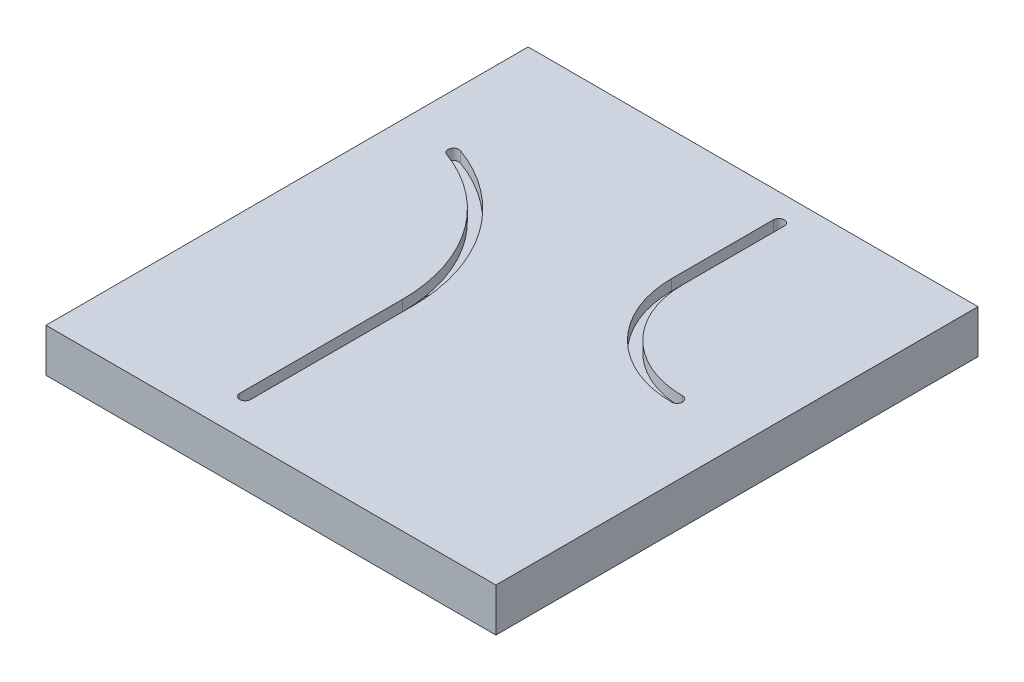
ISO-10303-21;
HEADER;
FILE_DESCRIPTION(('STEP AP214'),'2;1');
FILE_NAME('part.step','',(''),(''),'','','');
FILE_SCHEMA(('AUTOMOTIVE_DESIGN { 1 0 10303 214 1 1 1 1 }'));
ENDSEC;
DATA;
#1=APPLICATION_CONTEXT('core data for automotive mechanical design processes');
#2=APPLICATION_PROTOCOL_DEFINITION('international standard','automotive_design',2000,#1);
#3=PRODUCT_CONTEXT('',#1,'mechanical');
#4=PRODUCT('Part','Part','',(#3));
#5=PRODUCT_RELATED_PRODUCT_CATEGORY('part','',(#4));
#6=PRODUCT_DEFINITION_FORMATION('','',#4);
#7=PRODUCT_DEFINITION_CONTEXT('part definition',#1,'design');
#8=PRODUCT_DEFINITION('design','',#6,#7);
#9=PRODUCT_DEFINITION_SHAPE('','',#8);
#10=(LENGTH_UNIT() NAMED_UNIT(*) SI_UNIT(.MILLI.,.METRE.));
#11=(NAMED_UNIT(*) PLANE_ANGLE_UNIT() SI_UNIT($,.RADIAN.));
#12=(NAMED_UNIT(*) SI_UNIT($,.STERADIAN.) SOLID_ANGLE_UNIT());
#13=UNCERTAINTY_MEASURE_WITH_UNIT(LENGTH_MEASURE(1.E-05),#10,'distance_accuracy_value','');
#14=(GEOMETRIC_REPRESENTATION_CONTEXT(3) GLOBAL_UNCERTAINTY_ASSIGNED_CONTEXT((#13)) GLOBAL_UNIT_ASSIGNED_CONTEXT((#10,
#11,#12)) REPRESENTATION_CONTEXT('',''));
#15=CARTESIAN_POINT('',(0.,0.,0.));
#16=DIRECTION('',(0.,0.,1.));
#17=DIRECTION('',(1.,0.,0.));
#18=AXIS2_PLACEMENT_3D('',#15,#16,#17);
#19=CARTESIAN_POINT('',(0.,-8.,0.));
#20=DIRECTION('',(0.,-1.,0.));
#21=DIRECTION('',(0.,0.,-1.));
#22=AXIS2_PLACEMENT_3D('',#19,#20,#21);
#23=PLANE('',#22);
#24=DIRECTION('',(-0.214029557563818,0.,0.976827184556734));
#25=VECTOR('',#24,1.);
#26=CARTESIAN_POINT('',(-27.4536543691135,-8.,59.5719408848724));
#27=LINE('',#26,#25);
#28=CARTESIAN_POINT('',(-1.52559525398586,-8.,-58.7632707313958));
#29=VERTEX_POINT('',#28);
#30=CARTESIAN_POINT('',(-27.8817134842411,-8.,61.5255952539858));
#31=VERTEX_POINT('',#30);
#32=EDGE_CURVE('E346',#29,#31,#27,.T.);
#33=ORIENTED_EDGE('',*,*,#32,.F.);
#34=DIRECTION('',(-0.976827184556734,0.,-0.214029557563819));
#35=VECTOR('',#34,1.);
#36=CARTESIAN_POINT('',(-1.52559525398583,-8.,-58.7632707313957));
#37=LINE('',#36,#35);
#38=CARTESIAN_POINT('',(2.38171348424111,-8.,-57.9071525011405));
#39=VERTEX_POINT('',#38);
#40=EDGE_CURVE('E356',#39,#29,#37,.T.);
#41=ORIENTED_EDGE('',*,*,#40,.F.);
#42=DIRECTION('',(0.214029557563819,0.,-0.976827184556734));
#43=VECTOR('',#42,1.);
#44=CARTESIAN_POINT('',(2.38171348424111,-8.,-57.9071525011405));
#45=LINE('',#44,#43);
#46=CARTESIAN_POINT('',(-23.9744047460141,-8.,62.3817134842411));
#47=VERTEX_POINT('',#46);
#48=EDGE_CURVE('E370',#47,#39,#45,.T.);
#49=ORIENTED_EDGE('',*,*,#48,.F.);
#50=DIRECTION('',(0.976827184556734,0.,0.214029557563819));
#51=VECTOR('',#50,1.);
#52=CARTESIAN_POINT('',(-27.8817134842411,-8.,61.5255952539858));
#53=LINE('',#52,#51);
#54=EDGE_CURVE('E367',#31,#47,#53,.T.);
#55=ORIENTED_EDGE('',*,*,#54,.F.);
#56=EDGE_LOOP('',(#33,#41,#49,#55));
#57=FACE_BOUND('',#56,.T.);
#58=DIRECTION('',(0.,0.,1.));
#59=VECTOR('',#58,1.);
#60=CARTESIAN_POINT('',(-55.4787914004602,-8.00000000000001,-103.881557247155));
#61=LINE('',#60,#59);
#62=CARTESIAN_POINT('',(-55.4787914004602,-8.,-99.8815572471546));
#63=VERTEX_POINT('',#62);
#64=CARTESIAN_POINT('',(-55.4787914004602,-8.,70.));
#65=VERTEX_POINT('',#64);
#66=EDGE_CURVE('E424',#63,#65,#61,.T.);
#67=ORIENTED_EDGE('',*,*,#66,.T.);
#68=DIRECTION('',(1.,0.,0.));
#69=VECTOR('',#68,1.);
#70=CARTESIAN_POINT('',(-59.4787914004602,-8.00000000000001,70.));
#71=LINE('',#70,#69);
#72=CARTESIAN_POINT('',(102.52120859954,-8.,70.));
#73=VERTEX_POINT('',#72);
#74=EDGE_CURVE('E37',#65,#73,#71,.T.);
#75=ORIENTED_EDGE('',*,*,#74,.T.);
#76=DIRECTION('',(0.,0.,-1.));
#77=VECTOR('',#76,1.);
#78=CARTESIAN_POINT('',(102.52120859954,-8.00000000000001,-103.881557247155));
#79=LINE('',#78,#77);
#80=CARTESIAN_POINT('',(102.52120859954,-8.,-99.8815572471546));
#81=VERTEX_POINT('',#80);
#82=EDGE_CURVE('E434',#73,#81,#79,.T.);
#83=ORIENTED_EDGE('',*,*,#82,.T.);
#84=DIRECTION('',(-1.,0.,0.));
#85=VECTOR('',#84,1.);
#86=CARTESIAN_POINT('',(-59.4787914004602,-8.00000000000001,-99.8815572471546));
#87=LINE('',#86,#85);
#88=EDGE_CURVE('E429',#81,#63,#87,.T.);
#89=ORIENTED_EDGE('',*,*,#88,.T.);
#90=EDGE_LOOP('',(#67,#75,#83,#89));
#91=FACE_BOUND('',#90,.T.);
#92=ADVANCED_FACE('F33',(#57,#91),#23,.F.);
#93=CARTESIAN_POINT('',(-59.4787914004602,-259.306079678813,70.));
#94=DIRECTION('',(0.,0.,1.));
#95=DIRECTION('',(1.,0.,0.));
#96=AXIS2_PLACEMENT_3D('',#93,#94,#95);
#97=PLANE('',#96);
#98=DIRECTION('',(0.,1.,0.));
#99=VECTOR('',#98,1.);
#100=CARTESIAN_POINT('',(-55.4787914004602,-259.306079678813,70.));
#101=LINE('',#100,#99);
#102=CARTESIAN_POINT('',(-55.4787914004602,0.,70.));
#103=VERTEX_POINT('',#102);
#104=EDGE_CURVE('E422',#65,#103,#101,.T.);
#105=ORIENTED_EDGE('',*,*,#104,.T.);
#106=DIRECTION('',(1.,0.,0.));
#107=VECTOR('',#106,1.);
#108=CARTESIAN_POINT('',(0.,0.,70.));
#109=LINE('',#108,#107);
#110=CARTESIAN_POINT('',(102.52120859954,0.,70.));
#111=VERTEX_POINT('',#110);
#112=EDGE_CURVE('E416',#103,#111,#109,.T.);
#113=ORIENTED_EDGE('',*,*,#112,.T.);
#114=DIRECTION('',(0.,1.,0.));
#115=VECTOR('',#114,1.);
#116=CARTESIAN_POINT('',(102.52120859954,-259.306079678813,70.));
#117=LINE('',#116,#115);
#118=EDGE_CURVE('E436',#73,#111,#117,.T.);
#119=ORIENTED_EDGE('',*,*,#118,.F.);
#120=ORIENTED_EDGE('',*,*,#74,.F.);
#121=EDGE_LOOP('',(#105,#113,#119,#120));
#122=FACE_BOUND('',#121,.T.);
#123=ADVANCED_FACE('F443',(#122),#97,.F.);
#124=CARTESIAN_POINT('',(102.52120859954,-259.306079678813,-103.881557247155));
#125=DIRECTION('',(1.,0.,0.));
#126=DIRECTION('',(0.,0.,-1.));
#127=AXIS2_PLACEMENT_3D('',#124,#125,#126);
#128=PLANE('',#127);
#129=ORIENTED_EDGE('',*,*,#118,.T.);
#130=DIRECTION('',(0.,0.,-1.));
#131=VECTOR('',#130,1.);
#132=CARTESIAN_POINT('',(102.52120859954,0.,0.));
#133=LINE('',#132,#131);
#134=CARTESIAN_POINT('',(102.52120859954,0.,-99.8815572471546));
#135=VERTEX_POINT('',#134);
#136=EDGE_CURVE('E42',#111,#135,#133,.T.);
#137=ORIENTED_EDGE('',*,*,#136,.T.);
#138=DIRECTION('',(0.,1.,0.));
#139=VECTOR('',#138,1.);
#140=CARTESIAN_POINT('',(102.52120859954,-259.306079678813,-99.8815572471546));
#141=LINE('',#140,#139);
#142=EDGE_CURVE('E432',#81,#135,#141,.T.);
#143=ORIENTED_EDGE('',*,*,#142,.F.);
#144=ORIENTED_EDGE('',*,*,#82,.F.);
#145=EDGE_LOOP('',(#129,#137,#143,#144));
#146=FACE_BOUND('',#145,.T.);
#147=ADVANCED_FACE('F450',(#146),#128,.F.);
#148=CARTESIAN_POINT('',(-59.4787914004602,-259.306079678813,-99.8815572471546));
#149=DIRECTION('',(0.,0.,-1.));
#150=DIRECTION('',(-1.,0.,0.));
#151=AXIS2_PLACEMENT_3D('',#148,#149,#150);
#152=PLANE('',#151);
#153=ORIENTED_EDGE('',*,*,#142,.T.);
#154=DIRECTION('',(-1.,0.,0.));
#155=VECTOR('',#154,1.);
#156=CARTESIAN_POINT('',(0.,0.,-99.8815572471546));
#157=LINE('',#156,#155);
#158=CARTESIAN_POINT('',(-55.4787914004602,0.,-99.8815572471546));
#159=VERTEX_POINT('',#158);
#160=EDGE_CURVE('E11',#135,#159,#157,.T.);
#161=ORIENTED_EDGE('',*,*,#160,.T.);
#162=DIRECTION('',(0.,1.,0.));
#163=VECTOR('',#162,1.);
#164=CARTESIAN_POINT('',(-55.4787914004602,-259.306079678813,-99.8815572471546));
#165=LINE('',#164,#163);
#166=EDGE_CURVE('E427',#63,#159,#165,.T.);
#167=ORIENTED_EDGE('',*,*,#166,.F.);
#168=ORIENTED_EDGE('',*,*,#88,.F.);
#169=EDGE_LOOP('',(#153,#161,#167,#168));
#170=FACE_BOUND('',#169,.T.);
#171=ADVANCED_FACE('F452',(#170),#152,.F.);
#172=CARTESIAN_POINT('',(-55.4787914004602,-259.306079678813,-103.881557247155));
#173=DIRECTION('',(-1.,0.,0.));
#174=DIRECTION('',(0.,0.,1.));
#175=AXIS2_PLACEMENT_3D('',#172,#173,#174);
#176=PLANE('',#175);
#177=ORIENTED_EDGE('',*,*,#166,.T.);
#178=DIRECTION('',(0.,0.,1.));
#179=VECTOR('',#178,1.);
#180=CARTESIAN_POINT('',(-55.4787914004602,0.,0.));
#181=LINE('',#180,#179);
#182=EDGE_CURVE('E419',#159,#103,#181,.T.);
#183=ORIENTED_EDGE('',*,*,#182,.T.);
#184=ORIENTED_EDGE('',*,*,#104,.F.);
#185=ORIENTED_EDGE('',*,*,#66,.F.);
#186=EDGE_LOOP('',(#177,#183,#184,#185));
#187=FACE_BOUND('',#186,.T.);
#188=ADVANCED_FACE('F455',(#187),#176,.F.);
#189=CARTESIAN_POINT('',(0.,0.,0.));
#190=DIRECTION('',(0.,1.,0.));
#191=DIRECTION('',(0.,0.,1.));
#192=AXIS2_PLACEMENT_3D('',#189,#190,#191);
#193=PLANE('',#192);
#194=DIRECTION('',(0.,0.,-1.));
#195=VECTOR('',#194,1.);
#196=CARTESIAN_POINT('',(-2.,0.,60.));
#197=LINE('',#196,#195);
#198=CARTESIAN_POINT('',(-2.,0.,60.));
#199=VERTEX_POINT('',#198);
#200=CARTESIAN_POINT('',(-2.,0.,0.));
#201=VERTEX_POINT('',#200);
#202=EDGE_CURVE('E257',#199,#201,#197,.T.);
#203=ORIENTED_EDGE('',*,*,#202,.F.);
#204=CARTESIAN_POINT('',(0.,0.,60.));
#205=DIRECTION('',(0.,-1.,0.));
#206=DIRECTION('',(0.,0.,1.));
#207=AXIS2_PLACEMENT_3D('',#204,#205,#206);
#208=CIRCLE('',#207,2.);
#209=CARTESIAN_POINT('',(2.,0.,60.));
#210=VERTEX_POINT('',#209);
#211=EDGE_CURVE('E227',#210,#199,#208,.T.);
#212=ORIENTED_EDGE('',*,*,#211,.F.);
#213=DIRECTION('',(0.,0.,1.));
#214=VECTOR('',#213,1.);
#215=CARTESIAN_POINT('',(2.,0.,60.));
#216=LINE('',#215,#214);
#217=CARTESIAN_POINT('',(2.,0.,0.));
#218=VERTEX_POINT('',#217);
#219=EDGE_CURVE('E243',#218,#210,#216,.T.);
#220=ORIENTED_EDGE('',*,*,#219,.F.);
#221=CARTESIAN_POINT('',(-60.,0.,0.));
#222=DIRECTION('',(0.,-1.,0.));
#223=DIRECTION('',(0.,0.,-1.));
#224=AXIS2_PLACEMENT_3D('',#221,#222,#223);
#225=CIRCLE('',#224,62.);
#226=CARTESIAN_POINT('',(-38.7947511138089,0.,-58.2609424887265));
#227=VERTEX_POINT('',#226);
#228=EDGE_CURVE('E246',#227,#218,#225,.T.);
#229=ORIENTED_EDGE('',*,*,#228,.F.);
#230=CARTESIAN_POINT('',(-39.4787914004602,0.,-56.3815572471546));
#231=DIRECTION('',(0.,-1.,0.));
#232=DIRECTION('',(0.,0.,-1.));
#233=AXIS2_PLACEMENT_3D('',#230,#231,#232);
#234=CIRCLE('',#233,2.);
#235=CARTESIAN_POINT('',(-40.1628316871116,0.,-54.5021720055828));
#236=VERTEX_POINT('',#235);
#237=EDGE_CURVE('E263',#236,#227,#234,.T.);
#238=ORIENTED_EDGE('',*,*,#237,.F.);
#239=CARTESIAN_POINT('',(-60.,0.,0.));
#240=DIRECTION('',(0.,1.,0.));
#241=DIRECTION('',(0.,0.,-1.));
#242=AXIS2_PLACEMENT_3D('',#239,#240,#241);
#243=CIRCLE('',#242,58.);
#244=EDGE_CURVE('E260',#201,#236,#243,.T.);
#245=ORIENTED_EDGE('',*,*,#244,.F.);
#246=EDGE_LOOP('',(#203,#212,#220,#229,#238,#245));
#247=FACE_BOUND('',#246,.T.);
#248=CARTESIAN_POINT('',(80.5212085995398,0.,-56.3815572471546));
#249=DIRECTION('',(0.,-1.,0.));
#250=DIRECTION('',(0.,0.,-1.));
#251=AXIS2_PLACEMENT_3D('',#248,#249,#250);
#252=CIRCLE('',#251,39.5);
#253=CARTESIAN_POINT('',(80.5212085995398,0.,-16.8815572471546));
#254=VERTEX_POINT('',#253);
#255=CARTESIAN_POINT('',(41.0212085995398,0.,-56.3815572471546));
#256=VERTEX_POINT('',#255);
#257=EDGE_CURVE('E298',#254,#256,#252,.T.);
#258=ORIENTED_EDGE('',*,*,#257,.F.);
#259=CARTESIAN_POINT('',(80.5212085995397,0.,-18.8815572471546));
#260=DIRECTION('',(0.,-1.,0.));
#261=DIRECTION('',(0.,0.,1.));
#262=AXIS2_PLACEMENT_3D('',#259,#260,#261);
#263=CIRCLE('',#262,2.);
#264=CARTESIAN_POINT('',(80.5212085995397,0.,-20.8815572471546));
#265=VERTEX_POINT('',#264);
#266=EDGE_CURVE('E296',#265,#254,#263,.T.);
#267=ORIENTED_EDGE('',*,*,#266,.F.);
#268=CARTESIAN_POINT('',(80.5212085995398,0.,-56.3815572471546));
#269=DIRECTION('',(0.,1.,0.));
#270=DIRECTION('',(0.,0.,-1.));
#271=AXIS2_PLACEMENT_3D('',#268,#269,#270);
#272=CIRCLE('',#271,35.5);
#273=CARTESIAN_POINT('',(45.0212085995398,0.,-56.3815572471546));
#274=VERTEX_POINT('',#273);
#275=EDGE_CURVE('E282',#274,#265,#272,.T.);
#276=ORIENTED_EDGE('',*,*,#275,.F.);
#277=DIRECTION('',(0.,0.,1.));
#278=VECTOR('',#277,1.);
#279=CARTESIAN_POINT('',(45.0212085995398,0.,-93.8815572471546));
#280=LINE('',#279,#278);
#281=CARTESIAN_POINT('',(45.0212085995398,0.,-93.8815572471546));
#282=VERTEX_POINT('',#281);
#283=EDGE_CURVE('E307',#282,#274,#280,.T.);
#284=ORIENTED_EDGE('',*,*,#283,.F.);
#285=CARTESIAN_POINT('',(43.0212085995398,0.,-93.8815572471546));
#286=DIRECTION('',(0.,-1.,0.));
#287=DIRECTION('',(0.,0.,-1.));
#288=AXIS2_PLACEMENT_3D('',#285,#286,#287);
#289=CIRCLE('',#288,2.);
#290=CARTESIAN_POINT('',(41.0212085995398,0.,-93.8815572471546));
#291=VERTEX_POINT('',#290);
#292=EDGE_CURVE('E304',#291,#282,#289,.T.);
#293=ORIENTED_EDGE('',*,*,#292,.F.);
#294=DIRECTION('',(0.,0.,-1.));
#295=VECTOR('',#294,1.);
#296=CARTESIAN_POINT('',(41.0212085995398,0.,-93.8815572471546));
#297=LINE('',#296,#295);
#298=EDGE_CURVE('E301',#256,#291,#297,.T.);
#299=ORIENTED_EDGE('',*,*,#298,.F.);
#300=EDGE_LOOP('',(#258,#267,#276,#284,#293,#299));
#301=FACE_BOUND('',#300,.T.);
#302=DIRECTION('',(0.,0.,1.));
#303=VECTOR('',#302,1.);
#304=CARTESIAN_POINT('',(-42.4787914004603,0.,62.));
#305=LINE('',#304,#303);
#306=CARTESIAN_POINT('',(-42.4787914004603,0.,-57.9815572471546));
#307=VERTEX_POINT('',#306);
#308=CARTESIAN_POINT('',(-42.4787914004603,0.,62.));
#309=VERTEX_POINT('',#308);
#310=EDGE_CURVE('E336',#307,#309,#305,.T.);
#311=ORIENTED_EDGE('',*,*,#310,.F.);
#312=DIRECTION('',(1.,0.,0.));
#313=VECTOR('',#312,1.);
#314=CARTESIAN_POINT('',(-42.4787914004602,0.,-57.9815572471546));
#315=LINE('',#314,#313);
#316=CARTESIAN_POINT('',(-46.4787914004602,0.,-57.9815572471546));
#317=VERTEX_POINT('',#316);
#318=EDGE_CURVE('E270',#317,#307,#315,.T.);
#319=ORIENTED_EDGE('',*,*,#318,.F.);
#320=DIRECTION('',(0.,0.,-1.));
#321=VECTOR('',#320,1.);
#322=CARTESIAN_POINT('',(-46.4787914004602,0.,-56.3815572471546));
#323=LINE('',#322,#321);
#324=CARTESIAN_POINT('',(-46.4787914004603,0.,62.));
#325=VERTEX_POINT('',#324);
#326=EDGE_CURVE('E327',#325,#317,#323,.T.);
#327=ORIENTED_EDGE('',*,*,#326,.F.);
#328=DIRECTION('',(-1.,0.,0.));
#329=VECTOR('',#328,1.);
#330=CARTESIAN_POINT('',(-46.4787914004603,0.,62.));
#331=LINE('',#330,#329);
#332=EDGE_CURVE('E339',#309,#325,#331,.T.);
#333=ORIENTED_EDGE('',*,*,#332,.F.);
#334=EDGE_LOOP('',(#311,#319,#327,#333));
#335=FACE_BOUND('',#334,.T.);
#336=ORIENTED_EDGE('',*,*,#182,.F.);
#337=ORIENTED_EDGE('',*,*,#160,.F.);
#338=ORIENTED_EDGE('',*,*,#136,.F.);
#339=ORIENTED_EDGE('',*,*,#112,.F.);
#340=EDGE_LOOP('',(#336,#337,#338,#339));
#341=FACE_BOUND('',#340,.T.);
#342=ADVANCED_FACE('F35',(#247,#301,#335,#341),#193,.F.);
#343=CARTESIAN_POINT('',(-1.52559525398583,-10.,-58.7632707313957));
#344=DIRECTION('',(0.214029557563819,0.,-0.976827184556734));
#345=DIRECTION('',(-0.976827184556734,0.,-0.214029557563819));
#346=AXIS2_PLACEMENT_3D('',#343,#344,#345);
#347=PLANE('',#346);
#348=ORIENTED_EDGE('',*,*,#40,.T.);
#349=DIRECTION('',(0.,1.,0.));
#350=VECTOR('',#349,1.);
#351=CARTESIAN_POINT('',(-1.52559525398583,-10.,-58.7632707313957));
#352=LINE('',#351,#350);
#353=CARTESIAN_POINT('',(-1.52559525398583,-10.,-58.7632707313957));
#354=VERTEX_POINT('',#353);
#355=EDGE_CURVE('E374',#354,#29,#352,.T.);
#356=ORIENTED_EDGE('',*,*,#355,.F.);
#357=DIRECTION('',(-0.976827184556734,0.,-0.214029557563819));
#358=VECTOR('',#357,1.);
#359=CARTESIAN_POINT('',(-1.52559525398583,-10.,-58.7632707313957));
#360=LINE('',#359,#358);
#361=CARTESIAN_POINT('',(2.38171348424111,-10.,-57.9071525011405));
#362=VERTEX_POINT('',#361);
#363=EDGE_CURVE('E361',#362,#354,#360,.T.);
#364=ORIENTED_EDGE('',*,*,#363,.F.);
#365=DIRECTION('',(0.,1.,0.));
#366=VECTOR('',#365,1.);
#367=CARTESIAN_POINT('',(2.38171348424111,-10.,-57.9071525011405));
#368=LINE('',#367,#366);
#369=EDGE_CURVE('E378',#362,#39,#368,.T.);
#370=ORIENTED_EDGE('',*,*,#369,.T.);
#371=EDGE_LOOP('',(#348,#356,#364,#370));
#372=FACE_BOUND('',#371,.T.);
#373=ADVANCED_FACE('F461',(#372),#347,.F.);
#374=CARTESIAN_POINT('',(2.38171348424111,-10.,-57.9071525011405));
#375=DIRECTION('',(0.976827184556734,0.,0.214029557563819));
#376=DIRECTION('',(0.214029557563819,0.,-0.976827184556734));
#377=AXIS2_PLACEMENT_3D('',#374,#375,#376);
#378=PLANE('',#377);
#379=ORIENTED_EDGE('',*,*,#48,.T.);
#380=ORIENTED_EDGE('',*,*,#369,.F.);
#381=DIRECTION('',(0.214029557563816,0.,-0.976827184556735));
#382=VECTOR('',#381,1.);
#383=CARTESIAN_POINT('',(-23.9744047460141,-10.,62.3817134842411));
#384=LINE('',#383,#382);
#385=CARTESIAN_POINT('',(-23.9744047460141,-10.,62.3817134842411));
#386=VERTEX_POINT('',#385);
#387=EDGE_CURVE('E359',#386,#362,#384,.T.);
#388=ORIENTED_EDGE('',*,*,#387,.F.);
#389=DIRECTION('',(0.,1.,0.));
#390=VECTOR('',#389,1.);
#391=CARTESIAN_POINT('',(-23.9744047460141,-10.,62.3817134842411));
#392=LINE('',#391,#390);
#393=EDGE_CURVE('E380',#386,#47,#392,.T.);
#394=ORIENTED_EDGE('',*,*,#393,.T.);
#395=EDGE_LOOP('',(#379,#380,#388,#394));
#396=FACE_BOUND('',#395,.T.);
#397=ADVANCED_FACE('F507',(#396),#378,.F.);
#398=CARTESIAN_POINT('',(-27.8817134842411,-10.,61.5255952539858));
#399=DIRECTION('',(-0.214029557563819,0.,0.976827184556734));
#400=DIRECTION('',(0.976827184556734,0.,0.214029557563819));
#401=AXIS2_PLACEMENT_3D('',#398,#399,#400);
#402=PLANE('',#401);
#403=ORIENTED_EDGE('',*,*,#54,.T.);
#404=ORIENTED_EDGE('',*,*,#393,.F.);
#405=DIRECTION('',(0.976827184556734,0.,0.214029557563819));
#406=VECTOR('',#405,1.);
#407=CARTESIAN_POINT('',(-27.8817134842411,-10.,61.5255952539858));
#408=LINE('',#407,#406);
#409=CARTESIAN_POINT('',(-27.8817134842411,-10.,61.5255952539858));
#410=VERTEX_POINT('',#409);
#411=EDGE_CURVE('E355',#410,#386,#408,.T.);
#412=ORIENTED_EDGE('',*,*,#411,.F.);
#413=DIRECTION('',(0.,1.,0.));
#414=VECTOR('',#413,1.);
#415=CARTESIAN_POINT('',(-27.8817134842411,-10.,61.5255952539858));
#416=LINE('',#415,#414);
#417=EDGE_CURVE('E364',#410,#31,#416,.T.);
#418=ORIENTED_EDGE('',*,*,#417,.T.);
#419=EDGE_LOOP('',(#403,#404,#412,#418));
#420=FACE_BOUND('',#419,.T.);
#421=ADVANCED_FACE('F517',(#420),#402,.F.);
#422=CARTESIAN_POINT('',(-27.4536543691135,-10.,59.5719408848724));
#423=DIRECTION('',(-0.976827184556734,0.,-0.214029557563818));
#424=DIRECTION('',(-0.214029557563818,0.,0.976827184556734));
#425=AXIS2_PLACEMENT_3D('',#422,#423,#424);
#426=PLANE('',#425);
#427=ORIENTED_EDGE('',*,*,#32,.T.);
#428=ORIENTED_EDGE('',*,*,#417,.F.);
#429=DIRECTION('',(-0.214029557563818,0.,0.976827184556734));
#430=VECTOR('',#429,1.);
#431=CARTESIAN_POINT('',(-1.95365436911347,-10.,-56.8096163622823));
#432=LINE('',#431,#430);
#433=EDGE_CURVE('E353',#354,#410,#432,.T.);
#434=ORIENTED_EDGE('',*,*,#433,.F.);
#435=ORIENTED_EDGE('',*,*,#355,.T.);
#436=EDGE_LOOP('',(#427,#428,#434,#435));
#437=FACE_BOUND('',#436,.T.);
#438=ADVANCED_FACE('F533',(#437),#426,.F.);
#439=CARTESIAN_POINT('',(0.,-10.,0.));
#440=DIRECTION('',(0.,-1.,0.));
#441=DIRECTION('',(0.,0.,-1.));
#442=AXIS2_PLACEMENT_3D('',#439,#440,#441);
#443=PLANE('',#442);
#444=ORIENTED_EDGE('',*,*,#433,.T.);
#445=ORIENTED_EDGE('',*,*,#411,.T.);
#446=ORIENTED_EDGE('',*,*,#387,.T.);
#447=ORIENTED_EDGE('',*,*,#363,.T.);
#448=EDGE_LOOP('',(#444,#445,#446,#447));
#449=FACE_BOUND('',#448,.T.);
#450=ADVANCED_FACE('F543',(#449),#443,.F.);
#451=CARTESIAN_POINT('',(-42.4787914004602,2.,-57.9815572471546));
#452=DIRECTION('',(0.,0.,-1.));
#453=DIRECTION('',(-1.,0.,0.));
#454=AXIS2_PLACEMENT_3D('',#451,#452,#453);
#455=PLANE('',#454);
#456=ORIENTED_EDGE('',*,*,#318,.T.);
#457=DIRECTION('',(0.,-1.,0.));
#458=VECTOR('',#457,1.);
#459=CARTESIAN_POINT('',(-42.4787914004602,2.,-57.9815572471546));
#460=LINE('',#459,#458);
#461=CARTESIAN_POINT('',(-42.4787914004602,2.,-57.9815572471546));
#462=VERTEX_POINT('',#461);
#463=EDGE_CURVE('E334',#462,#307,#460,.T.);
#464=ORIENTED_EDGE('',*,*,#463,.F.);
#465=DIRECTION('',(1.,0.,0.));
#466=VECTOR('',#465,1.);
#467=CARTESIAN_POINT('',(-42.4787914004602,2.,-57.9815572471546));
#468=LINE('',#467,#466);
#469=CARTESIAN_POINT('',(-46.4787914004602,2.,-57.9815572471546));
#470=VERTEX_POINT('',#469);
#471=EDGE_CURVE('E323',#470,#462,#468,.T.);
#472=ORIENTED_EDGE('',*,*,#471,.F.);
#473=DIRECTION('',(0.,-1.,0.));
#474=VECTOR('',#473,1.);
#475=CARTESIAN_POINT('',(-46.4787914004602,2.,-57.9815572471546));
#476=LINE('',#475,#474);
#477=EDGE_CURVE('E344',#470,#317,#476,.T.);
#478=ORIENTED_EDGE('',*,*,#477,.T.);
#479=EDGE_LOOP('',(#456,#464,#472,#478));
#480=FACE_BOUND('',#479,.T.);
#481=ADVANCED_FACE('F559',(#480),#455,.F.);
#482=CARTESIAN_POINT('',(-46.4787914004602,2.,-56.3815572471546));
#483=DIRECTION('',(-1.,0.,0.));
#484=DIRECTION('',(0.,0.,1.));
#485=AXIS2_PLACEMENT_3D('',#482,#483,#484);
#486=PLANE('',#485);
#487=ORIENTED_EDGE('',*,*,#326,.T.);
#488=ORIENTED_EDGE('',*,*,#477,.F.);
#489=DIRECTION('',(0.,0.,-1.));
#490=VECTOR('',#489,1.);
#491=CARTESIAN_POINT('',(-46.4787914004603,2.,60.));
#492=LINE('',#491,#490);
#493=CARTESIAN_POINT('',(-46.4787914004603,2.,62.));
#494=VERTEX_POINT('',#493);
#495=EDGE_CURVE('E332',#494,#470,#492,.T.);
#496=ORIENTED_EDGE('',*,*,#495,.F.);
#497=DIRECTION('',(0.,-1.,0.));
#498=VECTOR('',#497,1.);
#499=CARTESIAN_POINT('',(-46.4787914004603,2.,62.));
#500=LINE('',#499,#498);
#501=EDGE_CURVE('E347',#494,#325,#500,.T.);
#502=ORIENTED_EDGE('',*,*,#501,.T.);
#503=EDGE_LOOP('',(#487,#488,#496,#502));
#504=FACE_BOUND('',#503,.T.);
#505=ADVANCED_FACE('F569',(#504),#486,.F.);
#506=CARTESIAN_POINT('',(-46.4787914004603,2.,62.));
#507=DIRECTION('',(0.,0.,1.));
#508=DIRECTION('',(1.,0.,0.));
#509=AXIS2_PLACEMENT_3D('',#506,#507,#508);
#510=PLANE('',#509);
#511=ORIENTED_EDGE('',*,*,#332,.T.);
#512=ORIENTED_EDGE('',*,*,#501,.F.);
#513=DIRECTION('',(-1.,0.,0.));
#514=VECTOR('',#513,1.);
#515=CARTESIAN_POINT('',(-46.4787914004603,2.,62.));
#516=LINE('',#515,#514);
#517=CARTESIAN_POINT('',(-42.4787914004603,2.,62.));
#518=VERTEX_POINT('',#517);
#519=EDGE_CURVE('E329',#518,#494,#516,.T.);
#520=ORIENTED_EDGE('',*,*,#519,.F.);
#521=DIRECTION('',(0.,-1.,0.));
#522=VECTOR('',#521,1.);
#523=CARTESIAN_POINT('',(-42.4787914004603,2.,62.));
#524=LINE('',#523,#522);
#525=EDGE_CURVE('E349',#518,#309,#524,.T.);
#526=ORIENTED_EDGE('',*,*,#525,.T.);
#527=EDGE_LOOP('',(#511,#512,#520,#526));
#528=FACE_BOUND('',#527,.T.);
#529=ADVANCED_FACE('F579',(#528),#510,.F.);
#530=CARTESIAN_POINT('',(-42.4787914004603,2.,62.));
#531=DIRECTION('',(1.,0.,0.));
#532=DIRECTION('',(0.,0.,-1.));
#533=AXIS2_PLACEMENT_3D('',#530,#531,#532);
#534=PLANE('',#533);
#535=ORIENTED_EDGE('',*,*,#310,.T.);
#536=ORIENTED_EDGE('',*,*,#525,.F.);
#537=DIRECTION('',(0.,0.,1.));
#538=VECTOR('',#537,1.);
#539=CARTESIAN_POINT('',(-42.4787914004602,2.,-56.3815572471546));
#540=LINE('',#539,#538);
#541=EDGE_CURVE('E326',#462,#518,#540,.T.);
#542=ORIENTED_EDGE('',*,*,#541,.F.);
#543=ORIENTED_EDGE('',*,*,#463,.T.);
#544=EDGE_LOOP('',(#535,#536,#542,#543));
#545=FACE_BOUND('',#544,.T.);
#546=ADVANCED_FACE('F595',(#545),#534,.F.);
#547=CARTESIAN_POINT('',(0.,2.,0.));
#548=DIRECTION('',(0.,-1.,0.));
#549=DIRECTION('',(0.,0.,-1.));
#550=AXIS2_PLACEMENT_3D('',#547,#548,#549);
#551=PLANE('',#550);
#552=ORIENTED_EDGE('',*,*,#471,.T.);
#553=ORIENTED_EDGE('',*,*,#541,.T.);
#554=ORIENTED_EDGE('',*,*,#519,.T.);
#555=ORIENTED_EDGE('',*,*,#495,.T.);
#556=EDGE_LOOP('',(#552,#553,#554,#555));
#557=FACE_BOUND('',#556,.T.);
#558=ADVANCED_FACE('F605',(#557),#551,.T.);
#559=CARTESIAN_POINT('',(80.5212085995397,4.,-18.8815572471546));
#560=DIRECTION('',(0.,-1.,0.));
#561=DIRECTION('',(0.,0.,-1.));
#562=AXIS2_PLACEMENT_3D('',#559,#560,#561);
#563=CYLINDRICAL_SURFACE('',#562,2.);
#564=ORIENTED_EDGE('',*,*,#266,.T.);
#565=DIRECTION('',(0.,-1.,0.));
#566=VECTOR('',#565,1.);
#567=CARTESIAN_POINT('',(80.5212085995397,4.,-16.8815572471546));
#568=LINE('',#567,#566);
#569=CARTESIAN_POINT('',(80.5212085995397,4.,-16.8815572471546));
#570=VERTEX_POINT('',#569);
#571=EDGE_CURVE('E295',#570,#254,#568,.T.);
#572=ORIENTED_EDGE('',*,*,#571,.F.);
#573=CARTESIAN_POINT('',(80.5212085995397,4.,-18.8815572471546));
#574=DIRECTION('',(0.,-1.,0.));
#575=DIRECTION('',(0.,0.,1.));
#576=AXIS2_PLACEMENT_3D('',#573,#574,#575);
#577=CIRCLE('',#576,2.);
#578=CARTESIAN_POINT('',(80.5212085995397,4.,-20.8815572471546));
#579=VERTEX_POINT('',#578);
#580=EDGE_CURVE('E278',#579,#570,#577,.T.);
#581=ORIENTED_EDGE('',*,*,#580,.F.);
#582=DIRECTION('',(0.,-1.,0.));
#583=VECTOR('',#582,1.);
#584=CARTESIAN_POINT('',(80.5212085995397,4.,-20.8815572471546));
#585=LINE('',#584,#583);
#586=EDGE_CURVE('E258',#579,#265,#585,.T.);
#587=ORIENTED_EDGE('',*,*,#586,.T.);
#588=EDGE_LOOP('',(#564,#572,#581,#587));
#589=FACE_BOUND('',#588,.T.);
#590=ADVANCED_FACE('F621',(#589),#563,.F.);
#591=CARTESIAN_POINT('',(80.5212085995398,4.,-56.3815572471546));
#592=DIRECTION('',(0.,-1.,0.));
#593=DIRECTION('',(0.,0.,-1.));
#594=AXIS2_PLACEMENT_3D('',#591,#592,#593);
#595=CYLINDRICAL_SURFACE('',#594,35.5);
#596=ORIENTED_EDGE('',*,*,#275,.T.);
#597=ORIENTED_EDGE('',*,*,#586,.F.);
#598=CARTESIAN_POINT('',(80.5212085995398,4.,-56.3815572471546));
#599=DIRECTION('',(0.,1.,0.));
#600=DIRECTION('',(0.,0.,-1.));
#601=AXIS2_PLACEMENT_3D('',#598,#599,#600);
#602=CIRCLE('',#601,35.5);
#603=CARTESIAN_POINT('',(45.0212085995398,4.,-56.3815572471546));
#604=VERTEX_POINT('',#603);
#605=EDGE_CURVE('E292',#604,#579,#602,.T.);
#606=ORIENTED_EDGE('',*,*,#605,.F.);
#607=DIRECTION('',(0.,-1.,0.));
#608=VECTOR('',#607,1.);
#609=CARTESIAN_POINT('',(45.0212085995398,4.,-56.3815572471546));
#610=LINE('',#609,#608);
#611=EDGE_CURVE('E313',#604,#274,#610,.T.);
#612=ORIENTED_EDGE('',*,*,#611,.T.);
#613=EDGE_LOOP('',(#596,#597,#606,#612));
#614=FACE_BOUND('',#613,.T.);
#615=ADVANCED_FACE('F631',(#614),#595,.T.);
#616=CARTESIAN_POINT('',(45.0212085995398,4.,-93.8815572471546));
#617=DIRECTION('',(1.,0.,0.));
#618=DIRECTION('',(0.,0.,-1.));
#619=AXIS2_PLACEMENT_3D('',#616,#617,#618);
#620=PLANE('',#619);
#621=ORIENTED_EDGE('',*,*,#283,.T.);
#622=ORIENTED_EDGE('',*,*,#611,.F.);
#623=DIRECTION('',(0.,0.,1.));
#624=VECTOR('',#623,1.);
#625=CARTESIAN_POINT('',(45.0212085995398,4.,-93.8815572471546));
#626=LINE('',#625,#624);
#627=CARTESIAN_POINT('',(45.0212085995398,4.,-93.8815572471546));
#628=VERTEX_POINT('',#627);
#629=EDGE_CURVE('E289',#628,#604,#626,.T.);
#630=ORIENTED_EDGE('',*,*,#629,.F.);
#631=DIRECTION('',(0.,-1.,0.));
#632=VECTOR('',#631,1.);
#633=CARTESIAN_POINT('',(45.0212085995398,4.,-93.8815572471546));
#634=LINE('',#633,#632);
#635=EDGE_CURVE('E315',#628,#282,#634,.T.);
#636=ORIENTED_EDGE('',*,*,#635,.T.);
#637=EDGE_LOOP('',(#621,#622,#630,#636));
#638=FACE_BOUND('',#637,.T.);
#639=ADVANCED_FACE('F641',(#638),#620,.F.);
#640=CARTESIAN_POINT('',(43.0212085995398,4.,-93.8815572471546));
#641=DIRECTION('',(0.,-1.,0.));
#642=DIRECTION('',(0.,0.,-1.));
#643=AXIS2_PLACEMENT_3D('',#640,#641,#642);
#644=CYLINDRICAL_SURFACE('',#643,2.);
#645=ORIENTED_EDGE('',*,*,#292,.T.);
#646=ORIENTED_EDGE('',*,*,#635,.F.);
#647=CARTESIAN_POINT('',(43.0212085995398,4.,-93.8815572471546));
#648=DIRECTION('',(0.,-1.,0.));
#649=DIRECTION('',(0.,0.,-1.));
#650=AXIS2_PLACEMENT_3D('',#647,#648,#649);
#651=CIRCLE('',#650,2.);
#652=CARTESIAN_POINT('',(41.0212085995398,4.,-93.8815572471546));
#653=VERTEX_POINT('',#652);
#654=EDGE_CURVE('E286',#653,#628,#651,.T.);
#655=ORIENTED_EDGE('',*,*,#654,.F.);
#656=DIRECTION('',(0.,-1.,0.));
#657=VECTOR('',#656,1.);
#658=CARTESIAN_POINT('',(41.0212085995398,4.,-93.8815572471546));
#659=LINE('',#658,#657);
#660=EDGE_CURVE('E317',#653,#291,#659,.T.);
#661=ORIENTED_EDGE('',*,*,#660,.T.);
#662=EDGE_LOOP('',(#645,#646,#655,#661));
#663=FACE_BOUND('',#662,.T.);
#664=ADVANCED_FACE('F651',(#663),#644,.F.);
#665=CARTESIAN_POINT('',(41.0212085995398,4.,-93.8815572471546));
#666=DIRECTION('',(-1.,0.,0.));
#667=DIRECTION('',(0.,0.,1.));
#668=AXIS2_PLACEMENT_3D('',#665,#666,#667);
#669=PLANE('',#668);
#670=ORIENTED_EDGE('',*,*,#298,.T.);
#671=ORIENTED_EDGE('',*,*,#660,.F.);
#672=DIRECTION('',(0.,0.,-1.));
#673=VECTOR('',#672,1.);
#674=CARTESIAN_POINT('',(41.0212085995398,4.,-93.8815572471546));
#675=LINE('',#674,#673);
#676=CARTESIAN_POINT('',(41.0212085995398,4.,-56.3815572471546));
#677=VERTEX_POINT('',#676);
#678=EDGE_CURVE('E58',#677,#653,#675,.T.);
#679=ORIENTED_EDGE('',*,*,#678,.F.);
#680=DIRECTION('',(0.,-1.,0.));
#681=VECTOR('',#680,1.);
#682=CARTESIAN_POINT('',(41.0212085995398,4.,-56.3815572471546));
#683=LINE('',#682,#681);
#684=EDGE_CURVE('E319',#677,#256,#683,.T.);
#685=ORIENTED_EDGE('',*,*,#684,.T.);
#686=EDGE_LOOP('',(#670,#671,#679,#685));
#687=FACE_BOUND('',#686,.T.);
#688=ADVANCED_FACE('F661',(#687),#669,.F.);
#689=CARTESIAN_POINT('',(80.5212085995398,4.,-56.3815572471546));
#690=DIRECTION('',(0.,-1.,0.));
#691=DIRECTION('',(0.,0.,-1.));
#692=AXIS2_PLACEMENT_3D('',#689,#690,#691);
#693=CYLINDRICAL_SURFACE('',#692,39.5);
#694=ORIENTED_EDGE('',*,*,#257,.T.);
#695=ORIENTED_EDGE('',*,*,#684,.F.);
#696=CARTESIAN_POINT('',(80.5212085995398,4.,-56.3815572471546));
#697=DIRECTION('',(0.,-1.,0.));
#698=DIRECTION('',(0.,0.,-1.));
#699=AXIS2_PLACEMENT_3D('',#696,#697,#698);
#700=CIRCLE('',#699,39.5);
#701=EDGE_CURVE('E281',#570,#677,#700,.T.);
#702=ORIENTED_EDGE('',*,*,#701,.F.);
#703=ORIENTED_EDGE('',*,*,#571,.T.);
#704=EDGE_LOOP('',(#694,#695,#702,#703));
#705=FACE_BOUND('',#704,.T.);
#706=ADVANCED_FACE('F671',(#705),#693,.F.);
#707=CARTESIAN_POINT('',(0.,4.,60.));
#708=DIRECTION('',(0.,-1.,0.));
#709=DIRECTION('',(0.,0.,-1.));
#710=AXIS2_PLACEMENT_3D('',#707,#708,#709);
#711=CYLINDRICAL_SURFACE('',#710,2.);
#712=ORIENTED_EDGE('',*,*,#211,.T.);
#713=DIRECTION('',(0.,-1.,0.));
#714=VECTOR('',#713,1.);
#715=CARTESIAN_POINT('',(-2.,4.,60.));
#716=LINE('',#715,#714);
#717=CARTESIAN_POINT('',(-2.,4.,60.));
#718=VERTEX_POINT('',#717);
#719=EDGE_CURVE('E220',#718,#199,#716,.T.);
#720=ORIENTED_EDGE('',*,*,#719,.F.);
#721=CARTESIAN_POINT('',(0.,4.,60.));
#722=DIRECTION('',(0.,-1.,0.));
#723=DIRECTION('',(0.,0.,1.));
#724=AXIS2_PLACEMENT_3D('',#721,#722,#723);
#725=CIRCLE('',#724,2.);
#726=CARTESIAN_POINT('',(2.,4.,60.));
#727=VERTEX_POINT('',#726);
#728=EDGE_CURVE('E224',#727,#718,#725,.T.);
#729=ORIENTED_EDGE('',*,*,#728,.F.);
#730=DIRECTION('',(0.,-1.,0.));
#731=VECTOR('',#730,1.);
#732=CARTESIAN_POINT('',(2.,4.,60.));
#733=LINE('',#732,#731);
#734=EDGE_CURVE('E268',#727,#210,#733,.T.);
#735=ORIENTED_EDGE('',*,*,#734,.T.);
#736=EDGE_LOOP('',(#712,#720,#729,#735));
#737=FACE_BOUND('',#736,.T.);
#738=ADVANCED_FACE('F222',(#737),#711,.F.);
#739=CARTESIAN_POINT('',(2.,4.,60.));
#740=DIRECTION('',(1.,0.,0.));
#741=DIRECTION('',(0.,0.,-1.));
#742=AXIS2_PLACEMENT_3D('',#739,#740,#741);
#743=PLANE('',#742);
#744=ORIENTED_EDGE('',*,*,#219,.T.);
#745=ORIENTED_EDGE('',*,*,#734,.F.);
#746=DIRECTION('',(0.,0.,1.));
#747=VECTOR('',#746,1.);
#748=CARTESIAN_POINT('',(2.,4.,60.));
#749=LINE('',#748,#747);
#750=CARTESIAN_POINT('',(2.,4.,0.));
#751=VERTEX_POINT('',#750);
#752=EDGE_CURVE('E232',#751,#727,#749,.T.);
#753=ORIENTED_EDGE('',*,*,#752,.F.);
#754=DIRECTION('',(0.,-1.,0.));
#755=VECTOR('',#754,1.);
#756=CARTESIAN_POINT('',(2.,4.,0.));
#757=LINE('',#756,#755);
#758=EDGE_CURVE('E271',#751,#218,#757,.T.);
#759=ORIENTED_EDGE('',*,*,#758,.T.);
#760=EDGE_LOOP('',(#744,#745,#753,#759));
#761=FACE_BOUND('',#760,.T.);
#762=ADVANCED_FACE('F689',(#761),#743,.F.);
#763=CARTESIAN_POINT('',(-60.,4.,0.));
#764=DIRECTION('',(0.,-1.,0.));
#765=DIRECTION('',(0.,0.,-1.));
#766=AXIS2_PLACEMENT_3D('',#763,#764,#765);
#767=CYLINDRICAL_SURFACE('',#766,62.);
#768=ORIENTED_EDGE('',*,*,#228,.T.);
#769=ORIENTED_EDGE('',*,*,#758,.F.);
#770=CARTESIAN_POINT('',(-60.,4.,0.));
#771=DIRECTION('',(0.,-1.,0.));
#772=DIRECTION('',(0.,0.,-1.));
#773=AXIS2_PLACEMENT_3D('',#770,#771,#772);
#774=CIRCLE('',#773,62.);
#775=CARTESIAN_POINT('',(-38.7947511138089,4.,-58.2609424887265));
#776=VERTEX_POINT('',#775);
#777=EDGE_CURVE('E253',#776,#751,#774,.T.);
#778=ORIENTED_EDGE('',*,*,#777,.F.);
#779=DIRECTION('',(0.,-1.,0.));
#780=VECTOR('',#779,1.);
#781=CARTESIAN_POINT('',(-38.7947511138089,4.,-58.2609424887265));
#782=LINE('',#781,#780);
#783=EDGE_CURVE('E273',#776,#227,#782,.T.);
#784=ORIENTED_EDGE('',*,*,#783,.T.);
#785=EDGE_LOOP('',(#768,#769,#778,#784));
#786=FACE_BOUND('',#785,.T.);
#787=ADVANCED_FACE('F698',(#786),#767,.F.);
#788=CARTESIAN_POINT('',(-39.4787914004602,4.,-56.3815572471546));
#789=DIRECTION('',(0.,-1.,0.));
#790=DIRECTION('',(0.,0.,-1.));
#791=AXIS2_PLACEMENT_3D('',#788,#789,#790);
#792=CYLINDRICAL_SURFACE('',#791,2.);
#793=ORIENTED_EDGE('',*,*,#237,.T.);
#794=ORIENTED_EDGE('',*,*,#783,.F.);
#795=CARTESIAN_POINT('',(-39.4787914004602,4.,-56.3815572471546));
#796=DIRECTION('',(0.,-1.,0.));
#797=DIRECTION('',(0.,0.,-1.));
#798=AXIS2_PLACEMENT_3D('',#795,#796,#797);
#799=CIRCLE('',#798,2.);
#800=CARTESIAN_POINT('',(-40.1628316871116,4.,-54.5021720055828));
#801=VERTEX_POINT('',#800);
#802=EDGE_CURVE('E250',#801,#776,#799,.T.);
#803=ORIENTED_EDGE('',*,*,#802,.F.);
#804=DIRECTION('',(0.,-1.,0.));
#805=VECTOR('',#804,1.);
#806=CARTESIAN_POINT('',(-40.1628316871116,4.,-54.5021720055828));
#807=LINE('',#806,#805);
#808=EDGE_CURVE('E275',#801,#236,#807,.T.);
#809=ORIENTED_EDGE('',*,*,#808,.T.);
#810=EDGE_LOOP('',(#793,#794,#803,#809));
#811=FACE_BOUND('',#810,.T.);
#812=ADVANCED_FACE('F708',(#811),#792,.F.);
#813=CARTESIAN_POINT('',(-60.,4.,0.));
#814=DIRECTION('',(0.,-1.,0.));
#815=DIRECTION('',(0.,0.,-1.));
#816=AXIS2_PLACEMENT_3D('',#813,#814,#815);
#817=CYLINDRICAL_SURFACE('',#816,58.);
#818=ORIENTED_EDGE('',*,*,#244,.T.);
#819=ORIENTED_EDGE('',*,*,#808,.F.);
#820=CARTESIAN_POINT('',(-60.,4.,0.));
#821=DIRECTION('',(0.,1.,0.));
#822=DIRECTION('',(0.,0.,-1.));
#823=AXIS2_PLACEMENT_3D('',#820,#821,#822);
#824=CIRCLE('',#823,58.);
#825=CARTESIAN_POINT('',(-2.,4.,0.));
#826=VERTEX_POINT('',#825);
#827=EDGE_CURVE('E50',#826,#801,#824,.T.);
#828=ORIENTED_EDGE('',*,*,#827,.F.);
#829=DIRECTION('',(0.,-1.,0.));
#830=VECTOR('',#829,1.);
#831=CARTESIAN_POINT('',(-2.,4.,0.));
#832=LINE('',#831,#830);
#833=EDGE_CURVE('E231',#826,#201,#832,.T.);
#834=ORIENTED_EDGE('',*,*,#833,.T.);
#835=EDGE_LOOP('',(#818,#819,#828,#834));
#836=FACE_BOUND('',#835,.T.);
#837=ADVANCED_FACE('F718',(#836),#817,.T.);
#838=CARTESIAN_POINT('',(-2.,4.,60.));
#839=DIRECTION('',(-1.,0.,0.));
#840=DIRECTION('',(0.,0.,1.));
#841=AXIS2_PLACEMENT_3D('',#838,#839,#840);
#842=PLANE('',#841);
#843=ORIENTED_EDGE('',*,*,#202,.T.);
#844=ORIENTED_EDGE('',*,*,#833,.F.);
#845=DIRECTION('',(0.,0.,-1.));
#846=VECTOR('',#845,1.);
#847=CARTESIAN_POINT('',(-2.,4.,60.));
#848=LINE('',#847,#846);
#849=EDGE_CURVE('E235',#718,#826,#848,.T.);
#850=ORIENTED_EDGE('',*,*,#849,.F.);
#851=ORIENTED_EDGE('',*,*,#719,.T.);
#852=EDGE_LOOP('',(#843,#844,#850,#851));
#853=FACE_BOUND('',#852,.T.);
#854=ADVANCED_FACE('F236',(#853),#842,.F.);
#855=CARTESIAN_POINT('',(0.,-12.,0.));
#856=DIRECTION('',(0.,-1.,0.));
#857=DIRECTION('',(0.,0.,-1.));
#858=AXIS2_PLACEMENT_3D('',#855,#856,#857);
#859=PLANE('',#858);
#860=DIRECTION('',(0.,0.,1.));
#861=VECTOR('',#860,1.);
#862=CARTESIAN_POINT('',(-59.4787914004602,-12.,-103.881557247155));
#863=LINE('',#862,#861);
#864=CARTESIAN_POINT('',(-59.4787914004602,-12.,-103.881557247155));
#865=VERTEX_POINT('',#864);
#866=CARTESIAN_POINT('',(-59.4787914004602,-12.,74.));
#867=VERTEX_POINT('',#866);
#868=EDGE_CURVE('E398',#865,#867,#863,.T.);
#869=ORIENTED_EDGE('',*,*,#868,.F.);
#870=DIRECTION('',(-1.,0.,0.));
#871=VECTOR('',#870,1.);
#872=CARTESIAN_POINT('',(-59.4787914004602,-12.,-103.881557247155));
#873=LINE('',#872,#871);
#874=CARTESIAN_POINT('',(106.52120859954,-12.,-103.881557247155));
#875=VERTEX_POINT('',#874);
#876=EDGE_CURVE('E403',#875,#865,#873,.T.);
#877=ORIENTED_EDGE('',*,*,#876,.F.);
#878=DIRECTION('',(0.,0.,-1.));
#879=VECTOR('',#878,1.);
#880=CARTESIAN_POINT('',(106.52120859954,-12.,-103.881557247155));
#881=LINE('',#880,#879);
#882=CARTESIAN_POINT('',(106.52120859954,-12.,74.));
#883=VERTEX_POINT('',#882);
#884=EDGE_CURVE('E407',#883,#875,#881,.T.);
#885=ORIENTED_EDGE('',*,*,#884,.F.);
#886=DIRECTION('',(1.,0.,0.));
#887=VECTOR('',#886,1.);
#888=CARTESIAN_POINT('',(-59.4787914004602,-12.,74.));
#889=LINE('',#888,#887);
#890=EDGE_CURVE('E394',#867,#883,#889,.T.);
#891=ORIENTED_EDGE('',*,*,#890,.F.);
#892=EDGE_LOOP('',(#869,#877,#885,#891));
#893=FACE_BOUND('',#892,.T.);
#894=ADVANCED_FACE('F473',(#893),#859,.T.);
#895=CARTESIAN_POINT('',(-59.4787914004602,-259.306079678813,74.));
#896=DIRECTION('',(0.,0.,1.));
#897=DIRECTION('',(1.,0.,0.));
#898=AXIS2_PLACEMENT_3D('',#895,#896,#897);
#899=PLANE('',#898);
#900=DIRECTION('',(0.,1.,0.));
#901=VECTOR('',#900,1.);
#902=CARTESIAN_POINT('',(-59.4787914004602,-259.306079678813,74.));
#903=LINE('',#902,#901);
#904=CARTESIAN_POINT('',(-59.4787914004602,4.,74.));
#905=VERTEX_POINT('',#904);
#906=EDGE_CURVE('E401',#867,#905,#903,.T.);
#907=ORIENTED_EDGE('',*,*,#906,.F.);
#908=ORIENTED_EDGE('',*,*,#890,.T.);
#909=DIRECTION('',(0.,1.,0.));
#910=VECTOR('',#909,1.);
#911=CARTESIAN_POINT('',(106.52120859954,-259.306079678813,74.));
#912=LINE('',#911,#910);
#913=CARTESIAN_POINT('',(106.52120859954,4.,74.));
#914=VERTEX_POINT('',#913);
#915=EDGE_CURVE('E397',#883,#914,#912,.T.);
#916=ORIENTED_EDGE('',*,*,#915,.T.);
#917=DIRECTION('',(1.,0.,0.));
#918=VECTOR('',#917,1.);
#919=CARTESIAN_POINT('',(-59.4787914004602,4.,74.));
#920=LINE('',#919,#918);
#921=EDGE_CURVE('E385',#905,#914,#920,.T.);
#922=ORIENTED_EDGE('',*,*,#921,.F.);
#923=EDGE_LOOP('',(#907,#908,#916,#922));
#924=FACE_BOUND('',#923,.T.);
#925=ADVANCED_FACE('F745',(#924),#899,.T.);
#926=CARTESIAN_POINT('',(106.52120859954,-259.306079678813,-103.881557247155));
#927=DIRECTION('',(1.,0.,0.));
#928=DIRECTION('',(0.,0.,-1.));
#929=AXIS2_PLACEMENT_3D('',#926,#927,#928);
#930=PLANE('',#929);
#931=ORIENTED_EDGE('',*,*,#915,.F.);
#932=ORIENTED_EDGE('',*,*,#884,.T.);
#933=DIRECTION('',(0.,1.,0.));
#934=VECTOR('',#933,1.);
#935=CARTESIAN_POINT('',(106.52120859954,-259.306079678813,-103.881557247155));
#936=LINE('',#935,#934);
#937=CARTESIAN_POINT('',(106.52120859954,4.,-103.881557247155));
#938=VERTEX_POINT('',#937);
#939=EDGE_CURVE('E406',#875,#938,#936,.T.);
#940=ORIENTED_EDGE('',*,*,#939,.T.);
#941=DIRECTION('',(0.,0.,-1.));
#942=VECTOR('',#941,1.);
#943=CARTESIAN_POINT('',(106.52120859954,4.,-103.881557247155));
#944=LINE('',#943,#942);
#945=EDGE_CURVE('E388',#914,#938,#944,.T.);
#946=ORIENTED_EDGE('',*,*,#945,.F.);
#947=EDGE_LOOP('',(#931,#932,#940,#946));
#948=FACE_BOUND('',#947,.T.);
#949=ADVANCED_FACE('F754',(#948),#930,.T.);
#950=CARTESIAN_POINT('',(-59.4787914004602,-259.306079678813,-103.881557247155));
#951=DIRECTION('',(0.,0.,-1.));
#952=DIRECTION('',(-1.,0.,0.));
#953=AXIS2_PLACEMENT_3D('',#950,#951,#952);
#954=PLANE('',#953);
#955=ORIENTED_EDGE('',*,*,#939,.F.);
#956=ORIENTED_EDGE('',*,*,#876,.T.);
#957=DIRECTION('',(0.,1.,0.));
#958=VECTOR('',#957,1.);
#959=CARTESIAN_POINT('',(-59.4787914004602,-259.306079678813,-103.881557247155));
#960=LINE('',#959,#958);
#961=CARTESIAN_POINT('',(-59.4787914004602,4.,-103.881557247155));
#962=VERTEX_POINT('',#961);
#963=EDGE_CURVE('E402',#865,#962,#960,.T.);
#964=ORIENTED_EDGE('',*,*,#963,.T.);
#965=DIRECTION('',(-1.,0.,0.));
#966=VECTOR('',#965,1.);
#967=CARTESIAN_POINT('',(-59.4787914004602,4.,-103.881557247155));
#968=LINE('',#967,#966);
#969=EDGE_CURVE('E391',#938,#962,#968,.T.);
#970=ORIENTED_EDGE('',*,*,#969,.F.);
#971=EDGE_LOOP('',(#955,#956,#964,#970));
#972=FACE_BOUND('',#971,.T.);
#973=ADVANCED_FACE('F763',(#972),#954,.T.);
#974=CARTESIAN_POINT('',(-59.4787914004602,-259.306079678813,-103.881557247155));
#975=DIRECTION('',(-1.,0.,0.));
#976=DIRECTION('',(0.,0.,1.));
#977=AXIS2_PLACEMENT_3D('',#974,#975,#976);
#978=PLANE('',#977);
#979=ORIENTED_EDGE('',*,*,#963,.F.);
#980=ORIENTED_EDGE('',*,*,#868,.T.);
#981=ORIENTED_EDGE('',*,*,#906,.T.);
#982=DIRECTION('',(0.,0.,1.));
#983=VECTOR('',#982,1.);
#984=CARTESIAN_POINT('',(-59.4787914004602,4.,-103.881557247155));
#985=LINE('',#984,#983);
#986=EDGE_CURVE('E377',#962,#905,#985,.T.);
#987=ORIENTED_EDGE('',*,*,#986,.F.);
#988=EDGE_LOOP('',(#979,#980,#981,#987));
#989=FACE_BOUND('',#988,.T.);
#990=ADVANCED_FACE('F773',(#989),#978,.T.);
#991=CARTESIAN_POINT('',(0.,4.,0.));
#992=DIRECTION('',(0.,1.,0.));
#993=DIRECTION('',(0.,0.,1.));
#994=AXIS2_PLACEMENT_3D('',#991,#992,#993);
#995=PLANE('',#994);
#996=ORIENTED_EDGE('',*,*,#728,.T.);
#997=ORIENTED_EDGE('',*,*,#849,.T.);
#998=ORIENTED_EDGE('',*,*,#827,.T.);
#999=ORIENTED_EDGE('',*,*,#802,.T.);
#1000=ORIENTED_EDGE('',*,*,#777,.T.);
#1001=ORIENTED_EDGE('',*,*,#752,.T.);
#1002=EDGE_LOOP('',(#996,#997,#998,#999,#1000,#1001));
#1003=FACE_BOUND('',#1002,.T.);
#1004=ORIENTED_EDGE('',*,*,#580,.T.);
#1005=ORIENTED_EDGE('',*,*,#701,.T.);
#1006=ORIENTED_EDGE('',*,*,#678,.T.);
#1007=ORIENTED_EDGE('',*,*,#654,.T.);
#1008=ORIENTED_EDGE('',*,*,#629,.T.);
#1009=ORIENTED_EDGE('',*,*,#605,.T.);
#1010=EDGE_LOOP('',(#1004,#1005,#1006,#1007,#1008,#1009));
#1011=FACE_BOUND('',#1010,.T.);
#1012=ORIENTED_EDGE('',*,*,#986,.T.);
#1013=ORIENTED_EDGE('',*,*,#921,.T.);
#1014=ORIENTED_EDGE('',*,*,#945,.T.);
#1015=ORIENTED_EDGE('',*,*,#969,.T.);
#1016=EDGE_LOOP('',(#1012,#1013,#1014,#1015));
#1017=FACE_BOUND('',#1016,.T.);
#1018=ADVANCED_FACE('F239',(#1003,#1011,#1017),#995,.T.);
#1019=CLOSED_SHELL('',(#92,#123,#147,#171,#188,#342,#373,#397,#421,#438,#450,#481,#505,#529,
#546,#558,#590,#615,#639,#664,#688,#706,#738,#762,#787,#812,#837,#854,#894,#925,#949,#973,#990,#1018));
#1020=MANIFOLD_SOLID_BREP('B2',#1019);
#1021=ADVANCED_BREP_SHAPE_REPRESENTATION('',(#18,#1020),#14);
#1022=SHAPE_DEFINITION_REPRESENTATION(#9,#1021);
ENDSEC;
END-ISO-10303-21;
